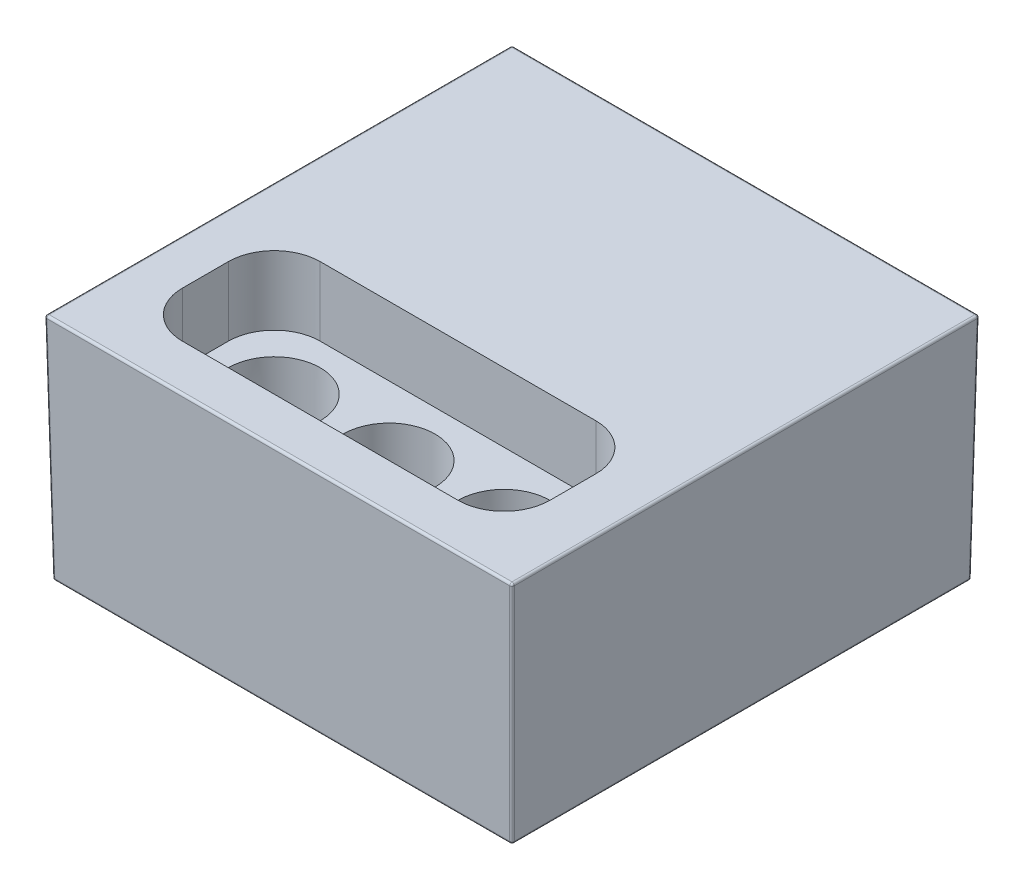
ISO-10303-21;
HEADER;
FILE_DESCRIPTION(('STEP AP214'),'2;1');
FILE_NAME('part.step','',(''),(''),'','','');
FILE_SCHEMA(('AUTOMOTIVE_DESIGN { 1 0 10303 214 1 1 1 1 }'));
ENDSEC;
DATA;
#1=APPLICATION_CONTEXT('core data for automotive mechanical design processes');
#2=APPLICATION_PROTOCOL_DEFINITION('international standard','automotive_design',2000,#1);
#3=PRODUCT_CONTEXT('',#1,'mechanical');
#4=PRODUCT('Part','Part','',(#3));
#5=PRODUCT_RELATED_PRODUCT_CATEGORY('part','',(#4));
#6=PRODUCT_DEFINITION_FORMATION('','',#4);
#7=PRODUCT_DEFINITION_CONTEXT('part definition',#1,'design');
#8=PRODUCT_DEFINITION('design','',#6,#7);
#9=PRODUCT_DEFINITION_SHAPE('','',#8);
#10=(LENGTH_UNIT() NAMED_UNIT(*) SI_UNIT(.MILLI.,.METRE.));
#11=(NAMED_UNIT(*) PLANE_ANGLE_UNIT() SI_UNIT($,.RADIAN.));
#12=(NAMED_UNIT(*) SI_UNIT($,.STERADIAN.) SOLID_ANGLE_UNIT());
#13=UNCERTAINTY_MEASURE_WITH_UNIT(LENGTH_MEASURE(1.E-05),#10,'distance_accuracy_value','');
#14=(GEOMETRIC_REPRESENTATION_CONTEXT(3) GLOBAL_UNCERTAINTY_ASSIGNED_CONTEXT((#13)) GLOBAL_UNIT_ASSIGNED_CONTEXT((#10,
#11,#12)) REPRESENTATION_CONTEXT('',''));
#15=CARTESIAN_POINT('',(0.,0.,0.));
#16=DIRECTION('',(0.,0.,1.));
#17=DIRECTION('',(1.,0.,0.));
#18=AXIS2_PLACEMENT_3D('',#15,#16,#17);
#19=CARTESIAN_POINT('',(0.,0.,0.));
#20=DIRECTION('',(-0.999847695156391,-0.0174524064372835,0.));
#21=DIRECTION('',(0.0174524064372835,-0.999847695156391,0.));
#22=AXIS2_PLACEMENT_3D('',#19,#20,#21);
#23=PLANE('',#22);
#24=DIRECTION('',(-0.0174497491606827,0.999695459881888,-0.0174497491606827));
#25=VECTOR('',#24,1.);
#26=CARTESIAN_POINT('',(0.0302971508921255,-1.7357226121312,-99.4697790015297));
#27=LINE('',#26,#25);
#28=CARTESIAN_POINT('',(-0.863873397503014,49.4912737967814,-100.363949549925));
#29=VERTEX_POINT('',#28);
#30=CARTESIAN_POINT('',(-0.0085752160203506,0.491273796781358,-99.5086513684422));
#31=VERTEX_POINT('',#30);
#32=EDGE_CURVE('E276',#29,#31,#27,.F.);
#33=ORIENTED_EDGE('',*,*,#32,.T.);
#34=DIRECTION('',(0.,0.,1.));
#35=VECTOR('',#34,1.);
#36=CARTESIAN_POINT('',(-0.0085752160203506,0.491273796781358,0.));
#37=LINE('',#36,#35);
#38=CARTESIAN_POINT('',(-0.0085752160203506,0.491273796781358,-0.491348631557845));
#39=VERTEX_POINT('',#38);
#40=EDGE_CURVE('E278',#31,#39,#37,.T.);
#41=ORIENTED_EDGE('',*,*,#40,.T.);
#42=DIRECTION('',(-0.0174497491606827,0.999695459881888,0.0174497491606827));
#43=VECTOR('',#42,1.);
#44=CARTESIAN_POINT('',(-0.000152223684949209,0.00872088907003297,-0.499771623893246));
#45=LINE('',#44,#43);
#46=CARTESIAN_POINT('',(-0.863873397503014,49.4912737967814,0.363949549924819));
#47=VERTEX_POINT('',#46);
#48=EDGE_CURVE('E272',#39,#47,#45,.T.);
#49=ORIENTED_EDGE('',*,*,#48,.T.);
#50=DIRECTION('',(0.,0.,1.));
#51=VECTOR('',#50,1.);
#52=CARTESIAN_POINT('',(-0.863873397503014,49.4912737967814,0.));
#53=LINE('',#52,#51);
#54=EDGE_CURVE('E274',#47,#29,#53,.F.);
#55=ORIENTED_EDGE('',*,*,#54,.T.);
#56=EDGE_LOOP('',(#33,#41,#49,#55));
#57=FACE_BOUND('',#56,.T.);
#58=ADVANCED_FACE('F33',(#57),#23,.T.);
#59=CARTESIAN_POINT('',(0.,0.,0.));
#60=DIRECTION('',(0.,-0.0174524064372835,0.999847695156391));
#61=DIRECTION('',(0.,-0.999847695156391,-0.0174524064372835));
#62=AXIS2_PLACEMENT_3D('',#59,#60,#61);
#63=PLANE('',#62);
#64=DIRECTION('',(-0.0174497491606827,0.999695459881888,0.0174497491606827));
#65=VECTOR('',#64,1.);
#66=CARTESIAN_POINT('',(0.499771623893247,0.00872088907003297,0.000152223684949209));
#67=LINE('',#66,#65);
#68=CARTESIAN_POINT('',(-0.363949549924819,49.4912737967814,0.863873397503014));
#69=VERTEX_POINT('',#68);
#70=CARTESIAN_POINT('',(0.491348631557845,0.491273796781358,0.0085752160203506));
#71=VERTEX_POINT('',#70);
#72=EDGE_CURVE('E236',#69,#71,#67,.F.);
#73=ORIENTED_EDGE('',*,*,#72,.T.);
#74=DIRECTION('',(1.,0.,0.));
#75=VECTOR('',#74,1.);
#76=CARTESIAN_POINT('',(100.,0.491273796781358,0.0085752160203506));
#77=LINE('',#76,#75);
#78=CARTESIAN_POINT('',(99.5086513684422,0.491273796781358,0.0085752160203506));
#79=VERTEX_POINT('',#78);
#80=EDGE_CURVE('E242',#71,#79,#77,.T.);
#81=ORIENTED_EDGE('',*,*,#80,.T.);
#82=DIRECTION('',(0.0174497491606827,0.999695459881888,0.0174497491606827));
#83=VECTOR('',#82,1.);
#84=CARTESIAN_POINT('',(99.4697790015297,-1.7357226121312,-0.0302971508921255));
#85=LINE('',#84,#83);
#86=CARTESIAN_POINT('',(100.363949549925,49.4912737967814,0.863873397503014));
#87=VERTEX_POINT('',#86);
#88=EDGE_CURVE('E240',#79,#87,#85,.T.);
#89=ORIENTED_EDGE('',*,*,#88,.T.);
#90=DIRECTION('',(1.,0.,0.));
#91=VECTOR('',#90,1.);
#92=CARTESIAN_POINT('',(0.,49.4912737967814,0.863873397503014));
#93=LINE('',#92,#91);
#94=EDGE_CURVE('E238',#87,#69,#93,.F.);
#95=ORIENTED_EDGE('',*,*,#94,.T.);
#96=EDGE_LOOP('',(#73,#81,#89,#95));
#97=FACE_BOUND('',#96,.T.);
#98=ADVANCED_FACE('F409',(#97),#63,.T.);
#99=CARTESIAN_POINT('',(100.,0.,0.));
#100=DIRECTION('',(0.999847695156391,-0.0174524064372835,0.));
#101=DIRECTION('',(0.0174524064372835,0.999847695156391,0.));
#102=AXIS2_PLACEMENT_3D('',#99,#100,#101);
#103=PLANE('',#102);
#104=DIRECTION('',(0.0174497491606827,0.999695459881888,0.0174497491606827));
#105=VECTOR('',#104,1.);
#106=CARTESIAN_POINT('',(100.000152223685,0.00872088907003297,-0.499771623893247));
#107=LINE('',#106,#105);
#108=CARTESIAN_POINT('',(100.863873397503,49.4912737967814,0.363949549924819));
#109=VERTEX_POINT('',#108);
#110=CARTESIAN_POINT('',(100.00857521602,0.491273796781358,-0.491348631557845));
#111=VERTEX_POINT('',#110);
#112=EDGE_CURVE('E254',#109,#111,#107,.F.);
#113=ORIENTED_EDGE('',*,*,#112,.T.);
#114=DIRECTION('',(0.,0.,-1.));
#115=VECTOR('',#114,1.);
#116=CARTESIAN_POINT('',(100.00857521602,0.491273796781358,-100.));
#117=LINE('',#116,#115);
#118=CARTESIAN_POINT('',(100.00857521602,0.491273796781358,-99.5086513684422));
#119=VERTEX_POINT('',#118);
#120=EDGE_CURVE('E260',#111,#119,#117,.T.);
#121=ORIENTED_EDGE('',*,*,#120,.T.);
#122=DIRECTION('',(0.0174497491606827,0.999695459881888,-0.0174497491606827));
#123=VECTOR('',#122,1.);
#124=CARTESIAN_POINT('',(99.9697028491079,-1.7357226121312,-99.4697790015297));
#125=LINE('',#124,#123);
#126=CARTESIAN_POINT('',(100.863873397503,49.4912737967814,-100.363949549925));
#127=VERTEX_POINT('',#126);
#128=EDGE_CURVE('E258',#119,#127,#125,.T.);
#129=ORIENTED_EDGE('',*,*,#128,.T.);
#130=DIRECTION('',(0.,0.,-1.));
#131=VECTOR('',#130,1.);
#132=CARTESIAN_POINT('',(100.863873397503,49.4912737967814,0.));
#133=LINE('',#132,#131);
#134=EDGE_CURVE('E256',#127,#109,#133,.F.);
#135=ORIENTED_EDGE('',*,*,#134,.T.);
#136=EDGE_LOOP('',(#113,#121,#129,#135));
#137=FACE_BOUND('',#136,.T.);
#138=ADVANCED_FACE('F415',(#137),#103,.T.);
#139=CARTESIAN_POINT('',(0.,0.,-100.));
#140=DIRECTION('',(0.,-0.0174524064372835,-0.999847695156391));
#141=DIRECTION('',(0.,0.999847695156391,-0.0174524064372835));
#142=AXIS2_PLACEMENT_3D('',#139,#140,#141);
#143=PLANE('',#142);
#144=DIRECTION('',(0.0174497491606827,0.999695459881888,-0.0174497491606827));
#145=VECTOR('',#144,1.);
#146=CARTESIAN_POINT('',(99.4697790015297,-1.7357226121312,-99.9697028491079));
#147=LINE('',#146,#145);
#148=CARTESIAN_POINT('',(100.363949549925,49.4912737967814,-100.863873397503));
#149=VERTEX_POINT('',#148);
#150=CARTESIAN_POINT('',(99.5086513684422,0.491273796781358,-100.00857521602));
#151=VERTEX_POINT('',#150);
#152=EDGE_CURVE('E267',#149,#151,#147,.F.);
#153=ORIENTED_EDGE('',*,*,#152,.T.);
#154=DIRECTION('',(-1.,0.,0.));
#155=VECTOR('',#154,1.);
#156=CARTESIAN_POINT('',(0.,0.491273796781358,-100.00857521602));
#157=LINE('',#156,#155);
#158=CARTESIAN_POINT('',(0.491348631557845,0.491273796781358,-100.00857521602));
#159=VERTEX_POINT('',#158);
#160=EDGE_CURVE('E269',#151,#159,#157,.T.);
#161=ORIENTED_EDGE('',*,*,#160,.T.);
#162=DIRECTION('',(-0.0174497491606827,0.999695459881888,-0.0174497491606827));
#163=VECTOR('',#162,1.);
#164=CARTESIAN_POINT('',(0.499771623893246,0.00872088907003297,-100.000152223685));
#165=LINE('',#164,#163);
#166=CARTESIAN_POINT('',(-0.363949549924819,49.4912737967814,-100.863873397503));
#167=VERTEX_POINT('',#166);
#168=EDGE_CURVE('E263',#159,#167,#165,.T.);
#169=ORIENTED_EDGE('',*,*,#168,.T.);
#170=DIRECTION('',(-1.,0.,0.));
#171=VECTOR('',#170,1.);
#172=CARTESIAN_POINT('',(0.,49.4912737967814,-100.863873397503));
#173=LINE('',#172,#171);
#174=EDGE_CURVE('E265',#167,#149,#173,.F.);
#175=ORIENTED_EDGE('',*,*,#174,.T.);
#176=EDGE_LOOP('',(#153,#161,#169,#175));
#177=FACE_BOUND('',#176,.T.);
#178=ADVANCED_FACE('F422',(#177),#143,.T.);
#179=CARTESIAN_POINT('',(0.,50.,0.));
#180=DIRECTION('',(0.,-1.,0.));
#181=DIRECTION('',(0.,0.,-1.));
#182=AXIS2_PLACEMENT_3D('',#179,#180,#181);
#183=PLANE('',#182);
#184=DIRECTION('',(-1.,0.,0.));
#185=VECTOR('',#184,1.);
#186=CARTESIAN_POINT('',(0.,50.,0.363949549924818));
#187=LINE('',#186,#185);
#188=CARTESIAN_POINT('',(-0.363949549924818,50.,0.363949549924818));
#189=VERTEX_POINT('',#188);
#190=CARTESIAN_POINT('',(100.363949549925,50.,0.363949549924818));
#191=VERTEX_POINT('',#190);
#192=EDGE_CURVE('E57',#189,#191,#187,.F.);
#193=ORIENTED_EDGE('',*,*,#192,.T.);
#194=DIRECTION('',(0.,0.,1.));
#195=VECTOR('',#194,1.);
#196=CARTESIAN_POINT('',(100.363949549925,50.,0.));
#197=LINE('',#196,#195);
#198=CARTESIAN_POINT('',(100.363949549925,50.,-100.363949549925));
#199=VERTEX_POINT('',#198);
#200=EDGE_CURVE('E11',#191,#199,#197,.F.);
#201=ORIENTED_EDGE('',*,*,#200,.T.);
#202=DIRECTION('',(1.,0.,0.));
#203=VECTOR('',#202,1.);
#204=CARTESIAN_POINT('',(0.,50.,-100.363949549925));
#205=LINE('',#204,#203);
#206=CARTESIAN_POINT('',(-0.363949549924818,50.,-100.363949549925));
#207=VERTEX_POINT('',#206);
#208=EDGE_CURVE('E42',#199,#207,#205,.F.);
#209=ORIENTED_EDGE('',*,*,#208,.T.);
#210=DIRECTION('',(0.,0.,-1.));
#211=VECTOR('',#210,1.);
#212=CARTESIAN_POINT('',(-0.363949549924818,50.,0.));
#213=LINE('',#212,#211);
#214=EDGE_CURVE('E281',#207,#189,#213,.F.);
#215=ORIENTED_EDGE('',*,*,#214,.T.);
#216=EDGE_LOOP('',(#193,#201,#209,#215));
#217=FACE_BOUND('',#216,.T.);
#218=DIRECTION('',(1.,0.,0.));
#219=VECTOR('',#218,1.);
#220=CARTESIAN_POINT('',(9.12724675358912,50.,-9.12724675358912));
#221=LINE('',#220,#219);
#222=CARTESIAN_POINT('',(19.1272467535891,50.,-9.12724675358912));
#223=VERTEX_POINT('',#222);
#224=CARTESIAN_POINT('',(79.1272467535891,50.,-9.12724675358912));
#225=VERTEX_POINT('',#224);
#226=EDGE_CURVE('E200',#223,#225,#221,.T.);
#227=ORIENTED_EDGE('',*,*,#226,.F.);
#228=CARTESIAN_POINT('',(19.1272467535891,50.,-19.1272467535891));
#229=DIRECTION('',(0.,-1.,0.));
#230=DIRECTION('',(0.,0.,-1.));
#231=AXIS2_PLACEMENT_3D('',#228,#229,#230);
#232=CIRCLE('',#231,10.);
#233=CARTESIAN_POINT('',(9.12724675358912,50.,-19.1272467535891));
#234=VERTEX_POINT('',#233);
#235=EDGE_CURVE('E234',#223,#234,#232,.T.);
#236=ORIENTED_EDGE('',*,*,#235,.T.);
#237=DIRECTION('',(0.,0.,1.));
#238=VECTOR('',#237,1.);
#239=CARTESIAN_POINT('',(9.12724675358912,50.,-9.12724675358912));
#240=LINE('',#239,#238);
#241=CARTESIAN_POINT('',(9.12724675358912,50.,-29.1272467535891));
#242=VERTEX_POINT('',#241);
#243=EDGE_CURVE('E205',#242,#234,#240,.T.);
#244=ORIENTED_EDGE('',*,*,#243,.F.);
#245=CARTESIAN_POINT('',(19.1272467535891,50.,-29.1272467535891));
#246=DIRECTION('',(0.,-1.,0.));
#247=DIRECTION('',(0.,0.,-1.));
#248=AXIS2_PLACEMENT_3D('',#245,#246,#247);
#249=CIRCLE('',#248,10.);
#250=CARTESIAN_POINT('',(19.1272467535891,50.,-39.1272467535891));
#251=VERTEX_POINT('',#250);
#252=EDGE_CURVE('E232',#242,#251,#249,.T.);
#253=ORIENTED_EDGE('',*,*,#252,.T.);
#254=DIRECTION('',(-1.,0.,0.));
#255=VECTOR('',#254,1.);
#256=CARTESIAN_POINT('',(9.12724675358912,50.,-39.1272467535891));
#257=LINE('',#256,#255);
#258=CARTESIAN_POINT('',(79.1272467535891,50.,-39.1272467535891));
#259=VERTEX_POINT('',#258);
#260=EDGE_CURVE('E199',#259,#251,#257,.T.);
#261=ORIENTED_EDGE('',*,*,#260,.F.);
#262=CARTESIAN_POINT('',(79.1272467535891,50.,-29.1272467535891));
#263=DIRECTION('',(0.,-1.,0.));
#264=DIRECTION('',(0.,0.,-1.));
#265=AXIS2_PLACEMENT_3D('',#262,#263,#264);
#266=CIRCLE('',#265,10.);
#267=CARTESIAN_POINT('',(89.1272467535891,50.,-29.1272467535891));
#268=VERTEX_POINT('',#267);
#269=EDGE_CURVE('E183',#259,#268,#266,.T.);
#270=ORIENTED_EDGE('',*,*,#269,.T.);
#271=DIRECTION('',(0.,0.,-1.));
#272=VECTOR('',#271,1.);
#273=CARTESIAN_POINT('',(89.1272467535891,50.,-9.12724675358912));
#274=LINE('',#273,#272);
#275=CARTESIAN_POINT('',(89.1272467535891,50.,-19.1272467535891));
#276=VERTEX_POINT('',#275);
#277=EDGE_CURVE('E190',#276,#268,#274,.T.);
#278=ORIENTED_EDGE('',*,*,#277,.F.);
#279=CARTESIAN_POINT('',(79.1272467535891,50.,-19.1272467535891));
#280=DIRECTION('',(0.,-1.,0.));
#281=DIRECTION('',(0.,0.,-1.));
#282=AXIS2_PLACEMENT_3D('',#279,#280,#281);
#283=CIRCLE('',#282,10.);
#284=EDGE_CURVE('E173',#276,#225,#283,.T.);
#285=ORIENTED_EDGE('',*,*,#284,.T.);
#286=EDGE_LOOP('',(#227,#236,#244,#253,#261,#270,#278,#285));
#287=FACE_BOUND('',#286,.T.);
#288=ADVANCED_FACE('F197',(#217,#287),#183,.F.);
#289=CARTESIAN_POINT('',(0.,0.,0.));
#290=DIRECTION('',(0.,-1.,0.));
#291=DIRECTION('',(0.,0.,-1.));
#292=AXIS2_PLACEMENT_3D('',#289,#290,#291);
#293=PLANE('',#292);
#294=DIRECTION('',(0.,0.,1.));
#295=VECTOR('',#294,1.);
#296=CARTESIAN_POINT('',(99.5086513684422,0.,0.));
#297=LINE('',#296,#295);
#298=CARTESIAN_POINT('',(99.5086513684422,0.,-99.5086513684422));
#299=VERTEX_POINT('',#298);
#300=CARTESIAN_POINT('',(99.5086513684422,0.,-0.491348631557845));
#301=VERTEX_POINT('',#300);
#302=EDGE_CURVE('E249',#299,#301,#297,.T.);
#303=ORIENTED_EDGE('',*,*,#302,.T.);
#304=DIRECTION('',(-1.,0.,0.));
#305=VECTOR('',#304,1.);
#306=CARTESIAN_POINT('',(0.,0.,-0.491348631557845));
#307=LINE('',#306,#305);
#308=CARTESIAN_POINT('',(0.491348631557845,0.,-0.491348631557845));
#309=VERTEX_POINT('',#308);
#310=EDGE_CURVE('E251',#301,#309,#307,.T.);
#311=ORIENTED_EDGE('',*,*,#310,.T.);
#312=DIRECTION('',(0.,0.,-1.));
#313=VECTOR('',#312,1.);
#314=CARTESIAN_POINT('',(0.491348631557845,0.,-100.));
#315=LINE('',#314,#313);
#316=CARTESIAN_POINT('',(0.491348631557845,0.,-99.5086513684422));
#317=VERTEX_POINT('',#316);
#318=EDGE_CURVE('E245',#309,#317,#315,.T.);
#319=ORIENTED_EDGE('',*,*,#318,.T.);
#320=DIRECTION('',(1.,0.,0.));
#321=VECTOR('',#320,1.);
#322=CARTESIAN_POINT('',(100.,0.,-99.5086513684422));
#323=LINE('',#322,#321);
#324=EDGE_CURVE('E247',#317,#299,#323,.T.);
#325=ORIENTED_EDGE('',*,*,#324,.T.);
#326=EDGE_LOOP('',(#303,#311,#319,#325));
#327=FACE_BOUND('',#326,.T.);
#328=ADVANCED_FACE('F420',(#327),#293,.T.);
#329=CARTESIAN_POINT('',(9.12724675358912,35.,-9.12724675358912));
#330=DIRECTION('',(-1.,0.,0.));
#331=DIRECTION('',(0.,0.,1.));
#332=AXIS2_PLACEMENT_3D('',#329,#330,#331);
#333=PLANE('',#332);
#334=DIRECTION('',(0.,0.,1.));
#335=VECTOR('',#334,1.);
#336=CARTESIAN_POINT('',(9.12724675358912,35.,-9.12724675358912));
#337=LINE('',#336,#335);
#338=CARTESIAN_POINT('',(9.12724675358912,35.,-29.1272467535891));
#339=VERTEX_POINT('',#338);
#340=CARTESIAN_POINT('',(9.12724675358912,35.,-19.1272467535891));
#341=VERTEX_POINT('',#340);
#342=EDGE_CURVE('E203',#339,#341,#337,.T.);
#343=ORIENTED_EDGE('',*,*,#342,.F.);
#344=DIRECTION('',(0.,1.,0.));
#345=VECTOR('',#344,1.);
#346=CARTESIAN_POINT('',(9.12724675358912,50.,-29.1272467535891));
#347=LINE('',#346,#345);
#348=EDGE_CURVE('E184',#339,#242,#347,.T.);
#349=ORIENTED_EDGE('',*,*,#348,.T.);
#350=ORIENTED_EDGE('',*,*,#243,.T.);
#351=DIRECTION('',(0.,1.,0.));
#352=VECTOR('',#351,1.);
#353=CARTESIAN_POINT('',(9.12724675358912,35.,-19.1272467535891));
#354=LINE('',#353,#352);
#355=EDGE_CURVE('E227',#234,#341,#354,.F.);
#356=ORIENTED_EDGE('',*,*,#355,.T.);
#357=EDGE_LOOP('',(#343,#349,#350,#356));
#358=FACE_BOUND('',#357,.T.);
#359=ADVANCED_FACE('F386',(#358),#333,.F.);
#360=CARTESIAN_POINT('',(9.12724675358912,35.,-39.1272467535891));
#361=DIRECTION('',(0.,0.,-1.));
#362=DIRECTION('',(-1.,0.,0.));
#363=AXIS2_PLACEMENT_3D('',#360,#361,#362);
#364=PLANE('',#363);
#365=DIRECTION('',(-1.,0.,0.));
#366=VECTOR('',#365,1.);
#367=CARTESIAN_POINT('',(9.12724675358912,35.,-39.1272467535891));
#368=LINE('',#367,#366);
#369=CARTESIAN_POINT('',(79.1272467535891,35.,-39.1272467535891));
#370=VERTEX_POINT('',#369);
#371=CARTESIAN_POINT('',(19.1272467535891,35.,-39.1272467535891));
#372=VERTEX_POINT('',#371);
#373=EDGE_CURVE('E209',#370,#372,#368,.T.);
#374=ORIENTED_EDGE('',*,*,#373,.F.);
#375=DIRECTION('',(0.,1.,0.));
#376=VECTOR('',#375,1.);
#377=CARTESIAN_POINT('',(79.1272467535891,50.,-39.1272467535891));
#378=LINE('',#377,#376);
#379=EDGE_CURVE('E224',#370,#259,#378,.T.);
#380=ORIENTED_EDGE('',*,*,#379,.T.);
#381=ORIENTED_EDGE('',*,*,#260,.T.);
#382=DIRECTION('',(0.,1.,0.));
#383=VECTOR('',#382,1.);
#384=CARTESIAN_POINT('',(19.1272467535891,35.,-39.1272467535891));
#385=LINE('',#384,#383);
#386=EDGE_CURVE('E222',#251,#372,#385,.F.);
#387=ORIENTED_EDGE('',*,*,#386,.T.);
#388=EDGE_LOOP('',(#374,#380,#381,#387));
#389=FACE_BOUND('',#388,.T.);
#390=ADVANCED_FACE('F405',(#389),#364,.F.);
#391=CARTESIAN_POINT('',(89.1272467535891,35.,-9.12724675358912));
#392=DIRECTION('',(1.,0.,0.));
#393=DIRECTION('',(0.,0.,-1.));
#394=AXIS2_PLACEMENT_3D('',#391,#392,#393);
#395=PLANE('',#394);
#396=DIRECTION('',(0.,0.,-1.));
#397=VECTOR('',#396,1.);
#398=CARTESIAN_POINT('',(89.1272467535891,35.,-9.12724675358912));
#399=LINE('',#398,#397);
#400=CARTESIAN_POINT('',(89.1272467535891,35.,-19.1272467535891));
#401=VERTEX_POINT('',#400);
#402=CARTESIAN_POINT('',(89.1272467535891,35.,-29.1272467535891));
#403=VERTEX_POINT('',#402);
#404=EDGE_CURVE('E193',#401,#403,#399,.T.);
#405=ORIENTED_EDGE('',*,*,#404,.F.);
#406=DIRECTION('',(0.,1.,0.));
#407=VECTOR('',#406,1.);
#408=CARTESIAN_POINT('',(89.1272467535891,50.,-19.1272467535891));
#409=LINE('',#408,#407);
#410=EDGE_CURVE('E177',#401,#276,#409,.T.);
#411=ORIENTED_EDGE('',*,*,#410,.T.);
#412=ORIENTED_EDGE('',*,*,#277,.T.);
#413=DIRECTION('',(0.,1.,0.));
#414=VECTOR('',#413,1.);
#415=CARTESIAN_POINT('',(89.1272467535891,35.,-29.1272467535891));
#416=LINE('',#415,#414);
#417=EDGE_CURVE('E195',#268,#403,#416,.F.);
#418=ORIENTED_EDGE('',*,*,#417,.T.);
#419=EDGE_LOOP('',(#405,#411,#412,#418));
#420=FACE_BOUND('',#419,.T.);
#421=ADVANCED_FACE('F189',(#420),#395,.F.);
#422=CARTESIAN_POINT('',(9.12724675358912,35.,-9.12724675358912));
#423=DIRECTION('',(0.,0.,1.));
#424=DIRECTION('',(1.,0.,0.));
#425=AXIS2_PLACEMENT_3D('',#422,#423,#424);
#426=PLANE('',#425);
#427=ORIENTED_EDGE('',*,*,#226,.T.);
#428=DIRECTION('',(0.,1.,0.));
#429=VECTOR('',#428,1.);
#430=CARTESIAN_POINT('',(79.1272467535891,35.,-9.12724675358912));
#431=LINE('',#430,#429);
#432=CARTESIAN_POINT('',(79.1272467535891,35.,-9.12724675358912));
#433=VERTEX_POINT('',#432);
#434=EDGE_CURVE('E178',#225,#433,#431,.F.);
#435=ORIENTED_EDGE('',*,*,#434,.T.);
#436=DIRECTION('',(1.,0.,0.));
#437=VECTOR('',#436,1.);
#438=CARTESIAN_POINT('',(9.12724675358912,35.,-9.12724675358912));
#439=LINE('',#438,#437);
#440=CARTESIAN_POINT('',(19.1272467535891,35.,-9.12724675358912));
#441=VERTEX_POINT('',#440);
#442=EDGE_CURVE('E376',#441,#433,#439,.T.);
#443=ORIENTED_EDGE('',*,*,#442,.F.);
#444=DIRECTION('',(0.,1.,0.));
#445=VECTOR('',#444,1.);
#446=CARTESIAN_POINT('',(19.1272467535891,50.,-9.12724675358912));
#447=LINE('',#446,#445);
#448=EDGE_CURVE('E194',#441,#223,#447,.T.);
#449=ORIENTED_EDGE('',*,*,#448,.T.);
#450=EDGE_LOOP('',(#427,#435,#443,#449));
#451=FACE_BOUND('',#450,.T.);
#452=ADVANCED_FACE('F396',(#451),#426,.F.);
#453=CARTESIAN_POINT('',(0.,35.,0.));
#454=DIRECTION('',(0.,-1.,0.));
#455=DIRECTION('',(0.,0.,-1.));
#456=AXIS2_PLACEMENT_3D('',#453,#454,#455);
#457=PLANE('',#456);
#458=CARTESIAN_POINT('',(49.1272467535891,35.,-24.1272467535891));
#459=DIRECTION('',(0.,1.,0.));
#460=DIRECTION('',(0.,0.,1.));
#461=AXIS2_PLACEMENT_3D('',#458,#459,#460);
#462=CIRCLE('',#461,10.);
#463=CARTESIAN_POINT('',(49.1272467535891,35.,-14.1272467535891));
#464=VERTEX_POINT('',#463);
#465=EDGE_CURVE('E349',#464,#464,#462,.T.);
#466=ORIENTED_EDGE('',*,*,#465,.F.);
#467=EDGE_LOOP('',(#466));
#468=FACE_BOUND('',#467,.T.);
#469=CARTESIAN_POINT('',(24.1272467535891,35.,-24.1272467535891));
#470=DIRECTION('',(0.,1.,0.));
#471=DIRECTION('',(0.,0.,1.));
#472=AXIS2_PLACEMENT_3D('',#469,#470,#471);
#473=CIRCLE('',#472,10.);
#474=CARTESIAN_POINT('',(24.1272467535891,35.,-14.1272467535891));
#475=VERTEX_POINT('',#474);
#476=EDGE_CURVE('E363',#475,#475,#473,.T.);
#477=ORIENTED_EDGE('',*,*,#476,.F.);
#478=EDGE_LOOP('',(#477));
#479=FACE_BOUND('',#478,.T.);
#480=CARTESIAN_POINT('',(74.1272467535891,35.,-24.1272467535891));
#481=DIRECTION('',(0.,1.,0.));
#482=DIRECTION('',(0.,0.,1.));
#483=AXIS2_PLACEMENT_3D('',#480,#481,#482);
#484=CIRCLE('',#483,9.99999999999999);
#485=CARTESIAN_POINT('',(74.1272467535891,35.,-14.1272467535891));
#486=VERTEX_POINT('',#485);
#487=EDGE_CURVE('E360',#486,#486,#484,.T.);
#488=ORIENTED_EDGE('',*,*,#487,.F.);
#489=EDGE_LOOP('',(#488));
#490=FACE_BOUND('',#489,.T.);
#491=ORIENTED_EDGE('',*,*,#442,.T.);
#492=CARTESIAN_POINT('',(79.1272467535891,35.,-19.1272467535891));
#493=DIRECTION('',(0.,-1.,0.));
#494=DIRECTION('',(0.,0.,-1.));
#495=AXIS2_PLACEMENT_3D('',#492,#493,#494);
#496=CIRCLE('',#495,10.);
#497=EDGE_CURVE('E220',#433,#401,#496,.F.);
#498=ORIENTED_EDGE('',*,*,#497,.T.);
#499=ORIENTED_EDGE('',*,*,#404,.T.);
#500=CARTESIAN_POINT('',(79.1272467535891,35.,-29.1272467535891));
#501=DIRECTION('',(0.,-1.,0.));
#502=DIRECTION('',(0.,0.,-1.));
#503=AXIS2_PLACEMENT_3D('',#500,#501,#502);
#504=CIRCLE('',#503,10.);
#505=EDGE_CURVE('E218',#403,#370,#504,.F.);
#506=ORIENTED_EDGE('',*,*,#505,.T.);
#507=ORIENTED_EDGE('',*,*,#373,.T.);
#508=CARTESIAN_POINT('',(19.1272467535891,35.,-29.1272467535891));
#509=DIRECTION('',(0.,-1.,0.));
#510=DIRECTION('',(0.,0.,-1.));
#511=AXIS2_PLACEMENT_3D('',#508,#509,#510);
#512=CIRCLE('',#511,10.);
#513=EDGE_CURVE('E216',#372,#339,#512,.F.);
#514=ORIENTED_EDGE('',*,*,#513,.T.);
#515=ORIENTED_EDGE('',*,*,#342,.T.);
#516=CARTESIAN_POINT('',(19.1272467535891,35.,-19.1272467535891));
#517=DIRECTION('',(0.,-1.,0.));
#518=DIRECTION('',(0.,0.,-1.));
#519=AXIS2_PLACEMENT_3D('',#516,#517,#518);
#520=CIRCLE('',#519,10.);
#521=EDGE_CURVE('E214',#341,#441,#520,.F.);
#522=ORIENTED_EDGE('',*,*,#521,.T.);
#523=EDGE_LOOP('',(#491,#498,#499,#506,#507,#514,#515,#522));
#524=FACE_BOUND('',#523,.T.);
#525=ADVANCED_FACE('F394',(#468,#479,#490,#524),#457,.F.);
#526=CARTESIAN_POINT('',(79.1272467535891,35.,-19.1272467535891));
#527=DIRECTION('',(0.,-1.,0.));
#528=DIRECTION('',(0.,0.,-1.));
#529=AXIS2_PLACEMENT_3D('',#526,#527,#528);
#530=CYLINDRICAL_SURFACE('',#529,10.);
#531=ORIENTED_EDGE('',*,*,#497,.F.);
#532=ORIENTED_EDGE('',*,*,#434,.F.);
#533=ORIENTED_EDGE('',*,*,#284,.F.);
#534=ORIENTED_EDGE('',*,*,#410,.F.);
#535=EDGE_LOOP('',(#531,#532,#533,#534));
#536=FACE_BOUND('',#535,.T.);
#537=ADVANCED_FACE('F176',(#536),#530,.F.);
#538=CARTESIAN_POINT('',(79.1272467535891,35.,-29.1272467535891));
#539=DIRECTION('',(0.,-1.,0.));
#540=DIRECTION('',(0.,0.,-1.));
#541=AXIS2_PLACEMENT_3D('',#538,#539,#540);
#542=CYLINDRICAL_SURFACE('',#541,10.);
#543=ORIENTED_EDGE('',*,*,#505,.F.);
#544=ORIENTED_EDGE('',*,*,#417,.F.);
#545=ORIENTED_EDGE('',*,*,#269,.F.);
#546=ORIENTED_EDGE('',*,*,#379,.F.);
#547=EDGE_LOOP('',(#543,#544,#545,#546));
#548=FACE_BOUND('',#547,.T.);
#549=ADVANCED_FACE('F431',(#548),#542,.F.);
#550=CARTESIAN_POINT('',(19.1272467535891,35.,-29.1272467535891));
#551=DIRECTION('',(0.,-1.,0.));
#552=DIRECTION('',(0.,0.,-1.));
#553=AXIS2_PLACEMENT_3D('',#550,#551,#552);
#554=CYLINDRICAL_SURFACE('',#553,10.);
#555=ORIENTED_EDGE('',*,*,#513,.F.);
#556=ORIENTED_EDGE('',*,*,#386,.F.);
#557=ORIENTED_EDGE('',*,*,#252,.F.);
#558=ORIENTED_EDGE('',*,*,#348,.F.);
#559=EDGE_LOOP('',(#555,#556,#557,#558));
#560=FACE_BOUND('',#559,.T.);
#561=ADVANCED_FACE('F434',(#560),#554,.F.);
#562=CARTESIAN_POINT('',(19.1272467535891,35.,-19.1272467535891));
#563=DIRECTION('',(0.,-1.,0.));
#564=DIRECTION('',(0.,0.,-1.));
#565=AXIS2_PLACEMENT_3D('',#562,#563,#564);
#566=CYLINDRICAL_SURFACE('',#565,10.);
#567=ORIENTED_EDGE('',*,*,#521,.F.);
#568=ORIENTED_EDGE('',*,*,#355,.F.);
#569=ORIENTED_EDGE('',*,*,#235,.F.);
#570=ORIENTED_EDGE('',*,*,#448,.F.);
#571=EDGE_LOOP('',(#567,#568,#569,#570));
#572=FACE_BOUND('',#571,.T.);
#573=ADVANCED_FACE('F390',(#572),#566,.F.);
#574=CARTESIAN_POINT('',(74.1272467535891,35.,-24.1272467535891));
#575=DIRECTION('',(0.,1.,0.));
#576=DIRECTION('',(0.,0.,1.));
#577=AXIS2_PLACEMENT_3D('',#574,#575,#576);
#578=CONICAL_SURFACE('',#577,9.99999999999999,0.00872664625997167);
#579=CARTESIAN_POINT('',(74.1272467535891,20.,-24.1272467535891));
#580=DIRECTION('',(0.,1.,0.));
#581=DIRECTION('',(0.,0.,1.));
#582=AXIS2_PLACEMENT_3D('',#579,#580,#581);
#583=CIRCLE('',#582,9.86909698313861);
#584=CARTESIAN_POINT('',(74.1272467535891,20.,-14.2581497704505));
#585=VERTEX_POINT('',#584);
#586=EDGE_CURVE('E367',#585,#585,#583,.T.);
#587=ORIENTED_EDGE('',*,*,#586,.F.);
#588=EDGE_LOOP('',(#587));
#589=FACE_BOUND('',#588,.T.);
#590=ORIENTED_EDGE('',*,*,#487,.T.);
#591=EDGE_LOOP('',(#590));
#592=FACE_BOUND('',#591,.T.);
#593=ADVANCED_FACE('F441',(#589,#592),#578,.F.);
#594=CARTESIAN_POINT('',(74.1272467535891,20.,-24.1272467535891));
#595=DIRECTION('',(0.,1.,0.));
#596=DIRECTION('',(0.,0.,1.));
#597=AXIS2_PLACEMENT_3D('',#594,#595,#596);
#598=PLANE('',#597);
#599=ORIENTED_EDGE('',*,*,#586,.T.);
#600=EDGE_LOOP('',(#599));
#601=FACE_BOUND('',#600,.T.);
#602=ADVANCED_FACE('F628',(#601),#598,.T.);
#603=CARTESIAN_POINT('',(24.1272467535891,35.,-24.1272467535891));
#604=DIRECTION('',(0.,1.,0.));
#605=DIRECTION('',(0.,0.,1.));
#606=AXIS2_PLACEMENT_3D('',#603,#604,#605);
#607=CONICAL_SURFACE('',#606,10.,0.00872664625997167);
#608=CARTESIAN_POINT('',(24.1272467535891,20.,-24.1272467535891));
#609=DIRECTION('',(0.,1.,0.));
#610=DIRECTION('',(0.,0.,1.));
#611=AXIS2_PLACEMENT_3D('',#608,#609,#610);
#612=CIRCLE('',#611,9.86909698313863);
#613=CARTESIAN_POINT('',(24.1272467535891,20.,-14.2581497704505));
#614=VERTEX_POINT('',#613);
#615=EDGE_CURVE('E366',#614,#614,#612,.T.);
#616=ORIENTED_EDGE('',*,*,#615,.F.);
#617=EDGE_LOOP('',(#616));
#618=FACE_BOUND('',#617,.T.);
#619=ORIENTED_EDGE('',*,*,#476,.T.);
#620=EDGE_LOOP('',(#619));
#621=FACE_BOUND('',#620,.T.);
#622=ADVANCED_FACE('F618',(#618,#621),#607,.F.);
#623=CARTESIAN_POINT('',(24.1272467535891,20.,-24.1272467535891));
#624=DIRECTION('',(0.,1.,0.));
#625=DIRECTION('',(0.,0.,1.));
#626=AXIS2_PLACEMENT_3D('',#623,#624,#625);
#627=PLANE('',#626);
#628=ORIENTED_EDGE('',*,*,#615,.T.);
#629=EDGE_LOOP('',(#628));
#630=FACE_BOUND('',#629,.T.);
#631=ADVANCED_FACE('F600',(#630),#627,.T.);
#632=CARTESIAN_POINT('',(49.1272467535891,5.,-24.1272467535891));
#633=DIRECTION('',(0.,1.,0.));
#634=DIRECTION('',(0.,0.,1.));
#635=AXIS2_PLACEMENT_3D('',#632,#633,#634);
#636=CYLINDRICAL_SURFACE('',#635,10.);
#637=CARTESIAN_POINT('',(49.1272467535891,5.,-24.1272467535891));
#638=DIRECTION('',(0.,1.,0.));
#639=DIRECTION('',(0.,0.,1.));
#640=AXIS2_PLACEMENT_3D('',#637,#638,#639);
#641=CIRCLE('',#640,10.);
#642=CARTESIAN_POINT('',(49.1272467535891,5.,-14.1272467535891));
#643=VERTEX_POINT('',#642);
#644=EDGE_CURVE('E355',#643,#643,#641,.T.);
#645=ORIENTED_EDGE('',*,*,#644,.F.);
#646=EDGE_LOOP('',(#645));
#647=FACE_BOUND('',#646,.T.);
#648=ORIENTED_EDGE('',*,*,#465,.T.);
#649=EDGE_LOOP('',(#648));
#650=FACE_BOUND('',#649,.T.);
#651=ADVANCED_FACE('F589',(#647,#650),#636,.F.);
#652=CARTESIAN_POINT('',(49.1272467535891,5.,-24.1272467535891));
#653=DIRECTION('',(0.,1.,0.));
#654=DIRECTION('',(0.,0.,1.));
#655=AXIS2_PLACEMENT_3D('',#652,#653,#654);
#656=PLANE('',#655);
#657=ORIENTED_EDGE('',*,*,#644,.T.);
#658=EDGE_LOOP('',(#657));
#659=FACE_BOUND('',#658,.T.);
#660=ADVANCED_FACE('F516',(#659),#656,.T.);
#661=CARTESIAN_POINT('',(0.,49.5,-100.363949549925));
#662=DIRECTION('',(1.,0.,0.));
#663=DIRECTION('',(0.,0.,-1.));
#664=AXIS2_PLACEMENT_3D('',#661,#662,#663);
#665=CYLINDRICAL_SURFACE('',#664,0.5);
#666=CARTESIAN_POINT('',(-0.363949549924818,49.5,-100.363949549925));
#667=DIRECTION('',(-1.,0.,0.));
#668=DIRECTION('',(0.,0.,1.));
#669=AXIS2_PLACEMENT_3D('',#666,#667,#668);
#670=CIRCLE('',#669,0.5);
#671=EDGE_CURVE('E37',#207,#167,#670,.T.);
#672=ORIENTED_EDGE('',*,*,#671,.F.);
#673=ORIENTED_EDGE('',*,*,#208,.F.);
#674=CARTESIAN_POINT('',(100.363949549925,49.5,-100.363949549925));
#675=DIRECTION('',(1.,0.,0.));
#676=DIRECTION('',(0.,1.,0.));
#677=AXIS2_PLACEMENT_3D('',#674,#675,#676);
#678=CIRCLE('',#677,0.5);
#679=EDGE_CURVE('E343',#149,#199,#678,.T.);
#680=ORIENTED_EDGE('',*,*,#679,.F.);
#681=ORIENTED_EDGE('',*,*,#174,.F.);
#682=EDGE_LOOP('',(#672,#673,#680,#681));
#683=FACE_BOUND('',#682,.T.);
#684=ADVANCED_FACE('F35',(#683),#665,.T.);
#685=CARTESIAN_POINT('',(-0.363949549924818,49.5,-100.363949549925));
#686=DIRECTION('',(0.,0.,1.));
#687=DIRECTION('',(1.,0.,0.));
#688=AXIS2_PLACEMENT_3D('',#685,#686,#687);
#689=SPHERICAL_SURFACE('',#688,0.5);
#690=CARTESIAN_POINT('',(-0.363949549924818,49.5,-100.363949549925));
#691=DIRECTION('',(0.,0.,-1.));
#692=DIRECTION('',(0.,1.,0.));
#693=AXIS2_PLACEMENT_3D('',#690,#691,#692);
#694=CIRCLE('',#693,0.5);
#695=EDGE_CURVE('E338',#207,#29,#694,.F.);
#696=ORIENTED_EDGE('',*,*,#695,.F.);
#697=ORIENTED_EDGE('',*,*,#671,.T.);
#698=CARTESIAN_POINT('',(-0.363949549924819,49.5,-100.363949549925));
#699=DIRECTION('',(-0.0174497491606869,0.999695459881887,-0.0174497491606867));
#700=DIRECTION('',(-0.999847695156391,-0.0174524064372877,0.));
#701=AXIS2_PLACEMENT_3D('',#698,#699,#700);
#702=CIRCLE('',#701,0.5);
#703=EDGE_CURVE('E341',#29,#167,#702,.F.);
#704=ORIENTED_EDGE('',*,*,#703,.F.);
#705=EDGE_LOOP('',(#696,#697,#704));
#706=FACE_BOUND('',#705,.T.);
#707=ADVANCED_FACE('F511',(#706),#689,.T.);
#708=CARTESIAN_POINT('',(100.363949549925,49.5,-100.363949549925));
#709=DIRECTION('',(0.,0.,1.));
#710=DIRECTION('',(1.,0.,0.));
#711=AXIS2_PLACEMENT_3D('',#708,#709,#710);
#712=SPHERICAL_SURFACE('',#711,0.5);
#713=CARTESIAN_POINT('',(100.363949549925,49.5,-100.363949549925));
#714=DIRECTION('',(0.0174497491606867,0.999695459881887,-0.0174497491606867));
#715=DIRECTION('',(0.,0.0174524064372875,0.999847695156391));
#716=AXIS2_PLACEMENT_3D('',#713,#714,#715);
#717=CIRCLE('',#716,0.5);
#718=EDGE_CURVE('E334',#149,#127,#717,.F.);
#719=ORIENTED_EDGE('',*,*,#718,.F.);
#720=ORIENTED_EDGE('',*,*,#679,.T.);
#721=CARTESIAN_POINT('',(100.363949549925,49.5,-100.363949549925));
#722=DIRECTION('',(0.,0.,-1.));
#723=DIRECTION('',(-1.,0.,0.));
#724=AXIS2_PLACEMENT_3D('',#721,#722,#723);
#725=CIRCLE('',#724,0.5);
#726=EDGE_CURVE('E50',#127,#199,#725,.F.);
#727=ORIENTED_EDGE('',*,*,#726,.F.);
#728=EDGE_LOOP('',(#719,#720,#727));
#729=FACE_BOUND('',#728,.T.);
#730=ADVANCED_FACE('F508',(#729),#712,.T.);
#731=CARTESIAN_POINT('',(0.530220998470321,-1.72699640891255,-99.4697790015297));
#732=DIRECTION('',(0.0174497491606827,-0.999695459881887,0.0174497491606827));
#733=DIRECTION('',(0.,-0.0174524064372835,-0.999847695156391));
#734=AXIS2_PLACEMENT_3D('',#731,#732,#733);
#735=CYLINDRICAL_SURFACE('',#734,0.5);
#736=ORIENTED_EDGE('',*,*,#703,.T.);
#737=ORIENTED_EDGE('',*,*,#168,.F.);
#738=CARTESIAN_POINT('',(0.491348631557845,0.5,-99.5086513684422));
#739=DIRECTION('',(0.0174497491606828,-0.999695459881887,0.0174497491606828));
#740=DIRECTION('',(0.,-0.0174524064372836,-0.999847695156391));
#741=AXIS2_PLACEMENT_3D('',#738,#739,#740);
#742=CIRCLE('',#741,0.5);
#743=EDGE_CURVE('E329',#31,#159,#742,.T.);
#744=ORIENTED_EDGE('',*,*,#743,.F.);
#745=ORIENTED_EDGE('',*,*,#32,.F.);
#746=EDGE_LOOP('',(#736,#737,#744,#745));
#747=FACE_BOUND('',#746,.T.);
#748=ADVANCED_FACE('F504',(#747),#735,.T.);
#749=CARTESIAN_POINT('',(-0.363949549924818,49.5,0.));
#750=DIRECTION('',(0.,0.,-1.));
#751=DIRECTION('',(-1.,0.,0.));
#752=AXIS2_PLACEMENT_3D('',#749,#750,#751);
#753=CYLINDRICAL_SURFACE('',#752,0.5);
#754=ORIENTED_EDGE('',*,*,#695,.T.);
#755=ORIENTED_EDGE('',*,*,#54,.F.);
#756=CARTESIAN_POINT('',(-0.363949549924818,49.5,0.363949549924818));
#757=DIRECTION('',(0.,0.,1.));
#758=DIRECTION('',(1.,0.,0.));
#759=AXIS2_PLACEMENT_3D('',#756,#757,#758);
#760=CIRCLE('',#759,0.5);
#761=EDGE_CURVE('E326',#189,#47,#760,.T.);
#762=ORIENTED_EDGE('',*,*,#761,.F.);
#763=ORIENTED_EDGE('',*,*,#214,.F.);
#764=EDGE_LOOP('',(#754,#755,#762,#763));
#765=FACE_BOUND('',#764,.T.);
#766=ADVANCED_FACE('F500',(#765),#753,.T.);
#767=CARTESIAN_POINT('',(0.,49.5,0.363949549924818));
#768=DIRECTION('',(-1.,0.,0.));
#769=DIRECTION('',(0.,0.,1.));
#770=AXIS2_PLACEMENT_3D('',#767,#768,#769);
#771=CYLINDRICAL_SURFACE('',#770,0.5);
#772=CARTESIAN_POINT('',(100.363949549925,49.5,0.363949549924818));
#773=DIRECTION('',(1.,0.,0.));
#774=DIRECTION('',(0.,0.,-1.));
#775=AXIS2_PLACEMENT_3D('',#772,#773,#774);
#776=CIRCLE('',#775,0.5);
#777=EDGE_CURVE('E320',#191,#87,#776,.T.);
#778=ORIENTED_EDGE('',*,*,#777,.F.);
#779=ORIENTED_EDGE('',*,*,#192,.F.);
#780=CARTESIAN_POINT('',(-0.363949549924819,49.5,0.363949549924818));
#781=DIRECTION('',(-1.,0.,0.));
#782=DIRECTION('',(0.,-1.,0.));
#783=AXIS2_PLACEMENT_3D('',#780,#781,#782);
#784=CIRCLE('',#783,0.5);
#785=EDGE_CURVE('E323',#69,#189,#784,.T.);
#786=ORIENTED_EDGE('',*,*,#785,.F.);
#787=ORIENTED_EDGE('',*,*,#94,.F.);
#788=EDGE_LOOP('',(#778,#779,#786,#787));
#789=FACE_BOUND('',#788,.T.);
#790=ADVANCED_FACE('F497',(#789),#771,.T.);
#791=CARTESIAN_POINT('',(100.363949549925,49.5,0.));
#792=DIRECTION('',(0.,0.,1.));
#793=DIRECTION('',(1.,0.,0.));
#794=AXIS2_PLACEMENT_3D('',#791,#792,#793);
#795=CYLINDRICAL_SURFACE('',#794,0.5);
#796=ORIENTED_EDGE('',*,*,#726,.T.);
#797=ORIENTED_EDGE('',*,*,#200,.F.);
#798=CARTESIAN_POINT('',(100.363949549925,49.5,0.363949549924819));
#799=DIRECTION('',(0.,0.,1.));
#800=DIRECTION('',(0.,-1.,0.));
#801=AXIS2_PLACEMENT_3D('',#798,#799,#800);
#802=CIRCLE('',#801,0.5);
#803=EDGE_CURVE('E317',#109,#191,#802,.T.);
#804=ORIENTED_EDGE('',*,*,#803,.F.);
#805=ORIENTED_EDGE('',*,*,#134,.F.);
#806=EDGE_LOOP('',(#796,#797,#804,#805));
#807=FACE_BOUND('',#806,.T.);
#808=ADVANCED_FACE('F493',(#807),#795,.T.);
#809=CARTESIAN_POINT('',(99.4697790015297,-1.72699640891255,-99.4697790015297));
#810=DIRECTION('',(-0.0174497491606827,-0.999695459881887,0.0174497491606827));
#811=DIRECTION('',(0.,-0.0174524064372835,-0.999847695156391));
#812=AXIS2_PLACEMENT_3D('',#809,#810,#811);
#813=CYLINDRICAL_SURFACE('',#812,0.5);
#814=ORIENTED_EDGE('',*,*,#718,.T.);
#815=ORIENTED_EDGE('',*,*,#128,.F.);
#816=CARTESIAN_POINT('',(99.5086513684422,0.5,-99.5086513684422));
#817=DIRECTION('',(-0.0174497491606826,-0.999695459881888,0.0174497491606826));
#818=DIRECTION('',(0.,-0.0174524064372834,-0.999847695156391));
#819=AXIS2_PLACEMENT_3D('',#816,#817,#818);
#820=CIRCLE('',#819,0.5);
#821=EDGE_CURVE('E314',#151,#119,#820,.T.);
#822=ORIENTED_EDGE('',*,*,#821,.F.);
#823=ORIENTED_EDGE('',*,*,#152,.F.);
#824=EDGE_LOOP('',(#814,#815,#822,#823));
#825=FACE_BOUND('',#824,.T.);
#826=ADVANCED_FACE('F489',(#825),#813,.T.);
#827=CARTESIAN_POINT('',(0.,0.5,-99.5086513684422));
#828=DIRECTION('',(-1.,0.,0.));
#829=DIRECTION('',(0.,0.,1.));
#830=AXIS2_PLACEMENT_3D('',#827,#828,#829);
#831=CYLINDRICAL_SURFACE('',#830,0.5);
#832=CARTESIAN_POINT('',(0.491348631557845,0.5,-99.5086513684422));
#833=DIRECTION('',(-1.,0.,0.));
#834=DIRECTION('',(0.,-1.,0.));
#835=AXIS2_PLACEMENT_3D('',#832,#833,#834);
#836=CIRCLE('',#835,0.5);
#837=EDGE_CURVE('E331',#159,#317,#836,.T.);
#838=ORIENTED_EDGE('',*,*,#837,.F.);
#839=ORIENTED_EDGE('',*,*,#160,.F.);
#840=CARTESIAN_POINT('',(99.5086513684422,0.5,-99.5086513684422));
#841=DIRECTION('',(1.,0.,0.));
#842=DIRECTION('',(0.,0.,-1.));
#843=AXIS2_PLACEMENT_3D('',#840,#841,#842);
#844=CIRCLE('',#843,0.5);
#845=EDGE_CURVE('E311',#299,#151,#844,.T.);
#846=ORIENTED_EDGE('',*,*,#845,.F.);
#847=ORIENTED_EDGE('',*,*,#324,.F.);
#848=EDGE_LOOP('',(#838,#839,#846,#847));
#849=FACE_BOUND('',#848,.T.);
#850=ADVANCED_FACE('F485',(#849),#831,.T.);
#851=CARTESIAN_POINT('',(0.491348631557845,0.5,-99.5086513684422));
#852=DIRECTION('',(0.,0.,1.));
#853=DIRECTION('',(1.,0.,0.));
#854=AXIS2_PLACEMENT_3D('',#851,#852,#853);
#855=SPHERICAL_SURFACE('',#854,0.5);
#856=ORIENTED_EDGE('',*,*,#743,.T.);
#857=ORIENTED_EDGE('',*,*,#837,.T.);
#858=CARTESIAN_POINT('',(0.491348631557845,0.5,-99.5086513684422));
#859=DIRECTION('',(0.,0.,-1.));
#860=DIRECTION('',(-1.,0.,0.));
#861=AXIS2_PLACEMENT_3D('',#858,#859,#860);
#862=CIRCLE('',#861,0.5);
#863=EDGE_CURVE('E308',#31,#317,#862,.F.);
#864=ORIENTED_EDGE('',*,*,#863,.F.);
#865=EDGE_LOOP('',(#856,#857,#864));
#866=FACE_BOUND('',#865,.T.);
#867=ADVANCED_FACE('F481',(#866),#855,.T.);
#868=CARTESIAN_POINT('',(-0.363949549924818,49.5,0.363949549924818));
#869=DIRECTION('',(0.,0.,1.));
#870=DIRECTION('',(1.,0.,0.));
#871=AXIS2_PLACEMENT_3D('',#868,#869,#870);
#872=SPHERICAL_SURFACE('',#871,0.5);
#873=ORIENTED_EDGE('',*,*,#785,.T.);
#874=ORIENTED_EDGE('',*,*,#761,.T.);
#875=CARTESIAN_POINT('',(-0.363949549924818,49.5,0.363949549924819));
#876=DIRECTION('',(-0.0174497491606869,0.999695459881887,0.0174497491606869));
#877=DIRECTION('',(-0.999847695156391,-0.0174524064372877,0.));
#878=AXIS2_PLACEMENT_3D('',#875,#876,#877);
#879=CIRCLE('',#878,0.5);
#880=EDGE_CURVE('E305',#69,#47,#879,.F.);
#881=ORIENTED_EDGE('',*,*,#880,.F.);
#882=EDGE_LOOP('',(#873,#874,#881));
#883=FACE_BOUND('',#882,.T.);
#884=ADVANCED_FACE('F477',(#883),#872,.T.);
#885=CARTESIAN_POINT('',(100.363949549925,49.5,0.363949549924818));
#886=DIRECTION('',(0.,0.,1.));
#887=DIRECTION('',(1.,0.,0.));
#888=AXIS2_PLACEMENT_3D('',#885,#886,#887);
#889=SPHERICAL_SURFACE('',#888,0.5);
#890=ORIENTED_EDGE('',*,*,#803,.T.);
#891=ORIENTED_EDGE('',*,*,#777,.T.);
#892=CARTESIAN_POINT('',(100.363949549925,49.5,0.363949549924818));
#893=DIRECTION('',(0.0174497491606867,0.999695459881887,0.0174497491606869));
#894=DIRECTION('',(0.,-0.0174524064372877,0.999847695156391));
#895=AXIS2_PLACEMENT_3D('',#892,#893,#894);
#896=CIRCLE('',#895,0.5);
#897=EDGE_CURVE('E302',#109,#87,#896,.F.);
#898=ORIENTED_EDGE('',*,*,#897,.F.);
#899=EDGE_LOOP('',(#890,#891,#898));
#900=FACE_BOUND('',#899,.T.);
#901=ADVANCED_FACE('F473',(#900),#889,.T.);
#902=CARTESIAN_POINT('',(99.5086513684422,0.5,-99.5086513684422));
#903=DIRECTION('',(0.,0.,1.));
#904=DIRECTION('',(1.,0.,0.));
#905=AXIS2_PLACEMENT_3D('',#902,#903,#904);
#906=SPHERICAL_SURFACE('',#905,0.5);
#907=ORIENTED_EDGE('',*,*,#845,.T.);
#908=ORIENTED_EDGE('',*,*,#821,.T.);
#909=CARTESIAN_POINT('',(99.5086513684422,0.5,-99.5086513684422));
#910=DIRECTION('',(0.,0.,-1.));
#911=DIRECTION('',(-1.,0.,0.));
#912=AXIS2_PLACEMENT_3D('',#909,#910,#911);
#913=CIRCLE('',#912,0.5);
#914=EDGE_CURVE('E300',#299,#119,#913,.F.);
#915=ORIENTED_EDGE('',*,*,#914,.F.);
#916=EDGE_LOOP('',(#907,#908,#915));
#917=FACE_BOUND('',#916,.T.);
#918=ADVANCED_FACE('F469',(#917),#906,.T.);
#919=CARTESIAN_POINT('',(0.491348631557845,0.5,0.));
#920=DIRECTION('',(0.,0.,1.));
#921=DIRECTION('',(1.,0.,0.));
#922=AXIS2_PLACEMENT_3D('',#919,#920,#921);
#923=CYLINDRICAL_SURFACE('',#922,0.5);
#924=ORIENTED_EDGE('',*,*,#863,.T.);
#925=ORIENTED_EDGE('',*,*,#318,.F.);
#926=CARTESIAN_POINT('',(0.491348631557845,0.5,-0.491348631557845));
#927=DIRECTION('',(0.,0.,1.));
#928=DIRECTION('',(0.,-1.,0.));
#929=AXIS2_PLACEMENT_3D('',#926,#927,#928);
#930=CIRCLE('',#929,0.5);
#931=EDGE_CURVE('E297',#39,#309,#930,.T.);
#932=ORIENTED_EDGE('',*,*,#931,.F.);
#933=ORIENTED_EDGE('',*,*,#40,.F.);
#934=EDGE_LOOP('',(#924,#925,#932,#933));
#935=FACE_BOUND('',#934,.T.);
#936=ADVANCED_FACE('F465',(#935),#923,.T.);
#937=CARTESIAN_POINT('',(0.499771623893246,0.0174470922886747,-0.499771623893246));
#938=DIRECTION('',(0.0174497491606827,-0.999695459881887,-0.0174497491606827));
#939=DIRECTION('',(0.,0.0174524064372835,-0.999847695156391));
#940=AXIS2_PLACEMENT_3D('',#937,#938,#939);
#941=CYLINDRICAL_SURFACE('',#940,0.5);
#942=ORIENTED_EDGE('',*,*,#880,.T.);
#943=ORIENTED_EDGE('',*,*,#48,.F.);
#944=CARTESIAN_POINT('',(0.491348631557845,0.5,-0.491348631557845));
#945=DIRECTION('',(0.0174497491606828,-0.999695459881887,-0.0174497491606828));
#946=DIRECTION('',(0.,0.0174524064372836,-0.999847695156391));
#947=AXIS2_PLACEMENT_3D('',#944,#945,#946);
#948=CIRCLE('',#947,0.5);
#949=EDGE_CURVE('E295',#71,#39,#948,.T.);
#950=ORIENTED_EDGE('',*,*,#949,.F.);
#951=ORIENTED_EDGE('',*,*,#72,.F.);
#952=EDGE_LOOP('',(#942,#943,#950,#951));
#953=FACE_BOUND('',#952,.T.);
#954=ADVANCED_FACE('F461',(#953),#941,.T.);
#955=CARTESIAN_POINT('',(99.5002283761067,0.0174470922886747,-0.499771623893246));
#956=DIRECTION('',(-0.0174497491606827,-0.999695459881887,-0.0174497491606827));
#957=DIRECTION('',(0.,0.0174524064372835,-0.999847695156391));
#958=AXIS2_PLACEMENT_3D('',#955,#956,#957);
#959=CYLINDRICAL_SURFACE('',#958,0.5);
#960=ORIENTED_EDGE('',*,*,#897,.T.);
#961=ORIENTED_EDGE('',*,*,#88,.F.);
#962=CARTESIAN_POINT('',(99.5086513684422,0.5,-0.491348631557845));
#963=DIRECTION('',(-0.0174497491606826,-0.999695459881887,-0.0174497491606826));
#964=DIRECTION('',(0.999847695156391,-0.0174524064372834,0.));
#965=AXIS2_PLACEMENT_3D('',#962,#963,#964);
#966=CIRCLE('',#965,0.5);
#967=EDGE_CURVE('E292',#111,#79,#966,.T.);
#968=ORIENTED_EDGE('',*,*,#967,.F.);
#969=ORIENTED_EDGE('',*,*,#112,.F.);
#970=EDGE_LOOP('',(#960,#961,#968,#969));
#971=FACE_BOUND('',#970,.T.);
#972=ADVANCED_FACE('F457',(#971),#959,.T.);
#973=CARTESIAN_POINT('',(99.5086513684422,0.5,0.));
#974=DIRECTION('',(0.,0.,-1.));
#975=DIRECTION('',(-1.,0.,0.));
#976=AXIS2_PLACEMENT_3D('',#973,#974,#975);
#977=CYLINDRICAL_SURFACE('',#976,0.5);
#978=ORIENTED_EDGE('',*,*,#914,.T.);
#979=ORIENTED_EDGE('',*,*,#120,.F.);
#980=CARTESIAN_POINT('',(99.5086513684422,0.5,-0.491348631557845));
#981=DIRECTION('',(0.,0.,1.));
#982=DIRECTION('',(1.,0.,0.));
#983=AXIS2_PLACEMENT_3D('',#980,#981,#982);
#984=CIRCLE('',#983,0.5);
#985=EDGE_CURVE('E289',#301,#111,#984,.T.);
#986=ORIENTED_EDGE('',*,*,#985,.F.);
#987=ORIENTED_EDGE('',*,*,#302,.F.);
#988=EDGE_LOOP('',(#978,#979,#986,#987));
#989=FACE_BOUND('',#988,.T.);
#990=ADVANCED_FACE('F453',(#989),#977,.T.);
#991=CARTESIAN_POINT('',(0.491348631557845,0.5,-0.491348631557845));
#992=DIRECTION('',(0.,0.,1.));
#993=DIRECTION('',(1.,0.,0.));
#994=AXIS2_PLACEMENT_3D('',#991,#992,#993);
#995=SPHERICAL_SURFACE('',#994,0.5);
#996=ORIENTED_EDGE('',*,*,#949,.T.);
#997=ORIENTED_EDGE('',*,*,#931,.T.);
#998=CARTESIAN_POINT('',(0.491348631557845,0.5,-0.491348631557845));
#999=DIRECTION('',(-1.,0.,0.));
#1000=DIRECTION('',(0.,0.,1.));
#1001=AXIS2_PLACEMENT_3D('',#998,#999,#1000);
#1002=CIRCLE('',#1001,0.5);
#1003=EDGE_CURVE('E287',#71,#309,#1002,.F.);
#1004=ORIENTED_EDGE('',*,*,#1003,.F.);
#1005=EDGE_LOOP('',(#996,#997,#1004));
#1006=FACE_BOUND('',#1005,.T.);
#1007=ADVANCED_FACE('F449',(#1006),#995,.T.);
#1008=CARTESIAN_POINT('',(99.5086513684422,0.5,-0.491348631557845));
#1009=DIRECTION('',(0.,0.,1.));
#1010=DIRECTION('',(1.,0.,0.));
#1011=AXIS2_PLACEMENT_3D('',#1008,#1009,#1010);
#1012=SPHERICAL_SURFACE('',#1011,0.5);
#1013=ORIENTED_EDGE('',*,*,#985,.T.);
#1014=ORIENTED_EDGE('',*,*,#967,.T.);
#1015=CARTESIAN_POINT('',(99.5086513684422,0.5,-0.491348631557845));
#1016=DIRECTION('',(1.,0.,0.));
#1017=DIRECTION('',(0.,0.,-1.));
#1018=AXIS2_PLACEMENT_3D('',#1015,#1016,#1017);
#1019=CIRCLE('',#1018,0.5);
#1020=EDGE_CURVE('E285',#301,#79,#1019,.F.);
#1021=ORIENTED_EDGE('',*,*,#1020,.F.);
#1022=EDGE_LOOP('',(#1013,#1014,#1021));
#1023=FACE_BOUND('',#1022,.T.);
#1024=ADVANCED_FACE('F445',(#1023),#1012,.T.);
#1025=CARTESIAN_POINT('',(0.,0.5,-0.491348631557845));
#1026=DIRECTION('',(1.,0.,0.));
#1027=DIRECTION('',(0.,0.,-1.));
#1028=AXIS2_PLACEMENT_3D('',#1025,#1026,#1027);
#1029=CYLINDRICAL_SURFACE('',#1028,0.5);
#1030=ORIENTED_EDGE('',*,*,#1003,.T.);
#1031=ORIENTED_EDGE('',*,*,#310,.F.);
#1032=ORIENTED_EDGE('',*,*,#1020,.T.);
#1033=ORIENTED_EDGE('',*,*,#80,.F.);
#1034=EDGE_LOOP('',(#1030,#1031,#1032,#1033));
#1035=FACE_BOUND('',#1034,.T.);
#1036=ADVANCED_FACE('F442',(#1035),#1029,.T.);
#1037=CLOSED_SHELL('',(#58,#98,#138,#178,#288,#328,#359,#390,#421,#452,#525,#537,#549,#561,#573,
#593,#602,#622,#631,#651,#660,#684,#707,#730,#748,#766,#790,#808,#826,#850,#867,#884,#901,#918,
#936,#954,#972,#990,#1007,#1024,#1036));
#1038=MANIFOLD_SOLID_BREP('B2',#1037);
#1039=ADVANCED_BREP_SHAPE_REPRESENTATION('',(#18,#1038),#14);
#1040=SHAPE_DEFINITION_REPRESENTATION(#9,#1039);
ENDSEC;
END-ISO-10303-21;
